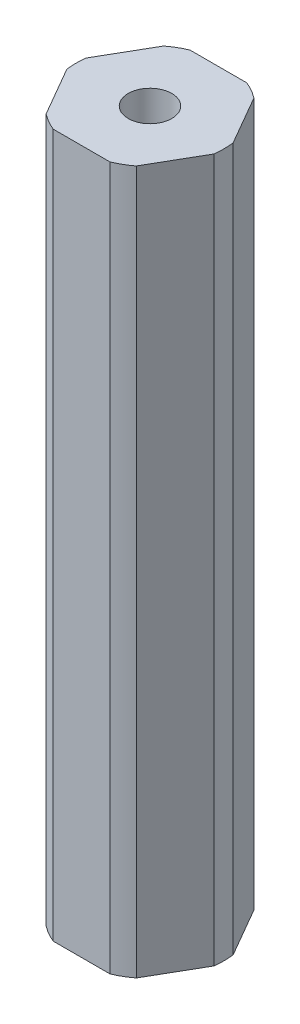
ISO-10303-21;
HEADER;
FILE_DESCRIPTION(('STEP AP214'),'2;1');
FILE_NAME('part.step','',(''),(''),'','','');
FILE_SCHEMA(('AUTOMOTIVE_DESIGN { 1 0 10303 214 1 1 1 1 }'));
ENDSEC;
DATA;
#1=APPLICATION_CONTEXT('core data for automotive mechanical design processes');
#2=APPLICATION_PROTOCOL_DEFINITION('international standard','automotive_design',2000,#1);
#3=PRODUCT_CONTEXT('',#1,'mechanical');
#4=PRODUCT('Part','Part','',(#3));
#5=PRODUCT_RELATED_PRODUCT_CATEGORY('part','',(#4));
#6=PRODUCT_DEFINITION_FORMATION('','',#4);
#7=PRODUCT_DEFINITION_CONTEXT('part definition',#1,'design');
#8=PRODUCT_DEFINITION('design','',#6,#7);
#9=PRODUCT_DEFINITION_SHAPE('','',#8);
#10=(LENGTH_UNIT() NAMED_UNIT(*) SI_UNIT(.MILLI.,.METRE.));
#11=(NAMED_UNIT(*) PLANE_ANGLE_UNIT() SI_UNIT($,.RADIAN.));
#12=(NAMED_UNIT(*) SI_UNIT($,.STERADIAN.) SOLID_ANGLE_UNIT());
#13=UNCERTAINTY_MEASURE_WITH_UNIT(LENGTH_MEASURE(1.E-05),#10,'distance_accuracy_value','');
#14=(GEOMETRIC_REPRESENTATION_CONTEXT(3) GLOBAL_UNCERTAINTY_ASSIGNED_CONTEXT((#13)) GLOBAL_UNIT_ASSIGNED_CONTEXT((#10,
#11,#12)) REPRESENTATION_CONTEXT('',''));
#15=CARTESIAN_POINT('',(0.,0.,0.));
#16=DIRECTION('',(0.,0.,1.));
#17=DIRECTION('',(1.,0.,0.));
#18=AXIS2_PLACEMENT_3D('',#15,#16,#17);
#19=CARTESIAN_POINT('',(5.49926131403119,65.2394428,3.175));
#20=DIRECTION('',(0.866025403784439,0.,0.5));
#21=DIRECTION('',(0.5,0.,-0.866025403784439));
#22=AXIS2_PLACEMENT_3D('',#19,#20,#21);
#23=PLANE('',#22);
#24=DIRECTION('',(-0.5,0.,0.866025403784439));
#25=VECTOR('',#24,1.);
#26=CARTESIAN_POINT('',(5.49926131403119,65.2394428,3.175));
#27=LINE('',#26,#25);
#28=CARTESIAN_POINT('',(6.81675182633099,65.2394428,0.893039494206794));
#29=VERTEX_POINT('',#28);
#30=CARTESIAN_POINT('',(4.18177080173138,65.2394428,5.45696050579321));
#31=VERTEX_POINT('',#30);
#32=EDGE_CURVE('E141',#29,#31,#27,.T.);
#33=ORIENTED_EDGE('',*,*,#32,.T.);
#34=DIRECTION('',(0.,-1.,0.));
#35=VECTOR('',#34,1.);
#36=CARTESIAN_POINT('',(4.18177080173138,68.4664939470401,5.45696050579321));
#37=LINE('',#36,#35);
#38=CARTESIAN_POINT('',(4.18177080173138,0.,5.45696050579321));
#39=VERTEX_POINT('',#38);
#40=EDGE_CURVE('E189',#31,#39,#37,.T.);
#41=ORIENTED_EDGE('',*,*,#40,.T.);
#42=DIRECTION('',(-0.5,0.,0.866025403784439));
#43=VECTOR('',#42,1.);
#44=CARTESIAN_POINT('',(5.49926131403119,0.,3.175));
#45=LINE('',#44,#43);
#46=CARTESIAN_POINT('',(6.81675182633099,0.,0.893039494206794));
#47=VERTEX_POINT('',#46);
#48=EDGE_CURVE('E131',#47,#39,#45,.T.);
#49=ORIENTED_EDGE('',*,*,#48,.F.);
#50=DIRECTION('',(0.,-1.,0.));
#51=VECTOR('',#50,1.);
#52=CARTESIAN_POINT('',(6.81675182633099,68.4664939470401,0.893039494206794));
#53=LINE('',#52,#51);
#54=EDGE_CURVE('E180',#47,#29,#53,.F.);
#55=ORIENTED_EDGE('',*,*,#54,.T.);
#56=EDGE_LOOP('',(#33,#41,#49,#55));
#57=FACE_BOUND('',#56,.T.);
#58=ADVANCED_FACE('F17',(#57),#23,.T.);
#59=CARTESIAN_POINT('',(0.,65.2394428,6.35));
#60=DIRECTION('',(0.,0.,1.));
#61=DIRECTION('',(1.,0.,0.));
#62=AXIS2_PLACEMENT_3D('',#59,#60,#61);
#63=PLANE('',#62);
#64=DIRECTION('',(-1.,0.,0.));
#65=VECTOR('',#64,1.);
#66=CARTESIAN_POINT('',(0.,65.2394428,6.35));
#67=LINE('',#66,#65);
#68=CARTESIAN_POINT('',(2.63498102459961,65.2394428,6.35));
#69=VERTEX_POINT('',#68);
#70=CARTESIAN_POINT('',(-2.63498102459961,65.2394428,6.35));
#71=VERTEX_POINT('',#70);
#72=EDGE_CURVE('E170',#69,#71,#67,.T.);
#73=ORIENTED_EDGE('',*,*,#72,.T.);
#74=DIRECTION('',(0.,-1.,0.));
#75=VECTOR('',#74,1.);
#76=CARTESIAN_POINT('',(-2.63498102459961,68.4664939470401,6.35));
#77=LINE('',#76,#75);
#78=CARTESIAN_POINT('',(-2.63498102459961,0.,6.35));
#79=VERTEX_POINT('',#78);
#80=EDGE_CURVE('E35',#71,#79,#77,.T.);
#81=ORIENTED_EDGE('',*,*,#80,.T.);
#82=DIRECTION('',(-1.,0.,0.));
#83=VECTOR('',#82,1.);
#84=CARTESIAN_POINT('',(0.,0.,6.35));
#85=LINE('',#84,#83);
#86=CARTESIAN_POINT('',(2.63498102459961,0.,6.35));
#87=VERTEX_POINT('',#86);
#88=EDGE_CURVE('E149',#87,#79,#85,.T.);
#89=ORIENTED_EDGE('',*,*,#88,.F.);
#90=DIRECTION('',(0.,-1.,0.));
#91=VECTOR('',#90,1.);
#92=CARTESIAN_POINT('',(2.63498102459961,68.4664939470401,6.35));
#93=LINE('',#92,#91);
#94=EDGE_CURVE('E193',#87,#69,#93,.F.);
#95=ORIENTED_EDGE('',*,*,#94,.T.);
#96=EDGE_LOOP('',(#73,#81,#89,#95));
#97=FACE_BOUND('',#96,.T.);
#98=ADVANCED_FACE('F250',(#97),#63,.T.);
#99=CARTESIAN_POINT('',(-5.49926131403119,65.2394428,3.175));
#100=DIRECTION('',(-0.866025403784439,0.,0.5));
#101=DIRECTION('',(0.5,0.,0.866025403784439));
#102=AXIS2_PLACEMENT_3D('',#99,#100,#101);
#103=PLANE('',#102);
#104=DIRECTION('',(-0.5,0.,-0.866025403784439));
#105=VECTOR('',#104,1.);
#106=CARTESIAN_POINT('',(-5.49926131403119,65.2394428,3.175));
#107=LINE('',#106,#105);
#108=CARTESIAN_POINT('',(-4.18177080173138,65.2394428,5.45696050579321));
#109=VERTEX_POINT('',#108);
#110=CARTESIAN_POINT('',(-6.81675182633099,65.2394428,0.893039494206794));
#111=VERTEX_POINT('',#110);
#112=EDGE_CURVE('E166',#109,#111,#107,.T.);
#113=ORIENTED_EDGE('',*,*,#112,.T.);
#114=DIRECTION('',(0.,-1.,0.));
#115=VECTOR('',#114,1.);
#116=CARTESIAN_POINT('',(-6.81675182633099,68.4664939470401,0.893039494206794));
#117=LINE('',#116,#115);
#118=CARTESIAN_POINT('',(-6.81675182633099,0.,0.893039494206794));
#119=VERTEX_POINT('',#118);
#120=EDGE_CURVE('E43',#111,#119,#117,.T.);
#121=ORIENTED_EDGE('',*,*,#120,.T.);
#122=DIRECTION('',(-0.5,0.,-0.866025403784439));
#123=VECTOR('',#122,1.);
#124=CARTESIAN_POINT('',(-5.49926131403119,0.,3.175));
#125=LINE('',#124,#123);
#126=CARTESIAN_POINT('',(-4.18177080173138,0.,5.45696050579321));
#127=VERTEX_POINT('',#126);
#128=EDGE_CURVE('E143',#127,#119,#125,.T.);
#129=ORIENTED_EDGE('',*,*,#128,.F.);
#130=DIRECTION('',(0.,-1.,0.));
#131=VECTOR('',#130,1.);
#132=CARTESIAN_POINT('',(-4.18177080173138,68.4664939470401,5.45696050579321));
#133=LINE('',#132,#131);
#134=EDGE_CURVE('E200',#127,#109,#133,.F.);
#135=ORIENTED_EDGE('',*,*,#134,.T.);
#136=EDGE_LOOP('',(#113,#121,#129,#135));
#137=FACE_BOUND('',#136,.T.);
#138=ADVANCED_FACE('F255',(#137),#103,.T.);
#139=CARTESIAN_POINT('',(-5.49926131403119,65.2394428,-3.175));
#140=DIRECTION('',(-0.866025403784439,0.,-0.5));
#141=DIRECTION('',(-0.5,0.,0.866025403784439));
#142=AXIS2_PLACEMENT_3D('',#139,#140,#141);
#143=PLANE('',#142);
#144=DIRECTION('',(0.5,0.,-0.866025403784439));
#145=VECTOR('',#144,1.);
#146=CARTESIAN_POINT('',(-5.49926131403119,65.2394428,-3.175));
#147=LINE('',#146,#145);
#148=CARTESIAN_POINT('',(-6.81675182633099,65.2394428,-0.893039494206793));
#149=VERTEX_POINT('',#148);
#150=CARTESIAN_POINT('',(-4.18177080173138,65.2394428,-5.45696050579321));
#151=VERTEX_POINT('',#150);
#152=EDGE_CURVE('E162',#149,#151,#147,.T.);
#153=ORIENTED_EDGE('',*,*,#152,.T.);
#154=DIRECTION('',(0.,-1.,0.));
#155=VECTOR('',#154,1.);
#156=CARTESIAN_POINT('',(-4.18177080173138,68.4664939470401,-5.45696050579321));
#157=LINE('',#156,#155);
#158=CARTESIAN_POINT('',(-4.18177080173138,0.,-5.45696050579321));
#159=VERTEX_POINT('',#158);
#160=EDGE_CURVE('E212',#151,#159,#157,.T.);
#161=ORIENTED_EDGE('',*,*,#160,.T.);
#162=DIRECTION('',(0.5,0.,-0.866025403784439));
#163=VECTOR('',#162,1.);
#164=CARTESIAN_POINT('',(-5.49926131403119,0.,-3.175));
#165=LINE('',#164,#163);
#166=CARTESIAN_POINT('',(-6.81675182633099,0.,-0.893039494206793));
#167=VERTEX_POINT('',#166);
#168=EDGE_CURVE('E137',#167,#159,#165,.T.);
#169=ORIENTED_EDGE('',*,*,#168,.F.);
#170=DIRECTION('',(0.,-1.,0.));
#171=VECTOR('',#170,1.);
#172=CARTESIAN_POINT('',(-6.81675182633099,68.4664939470401,-0.893039494206793));
#173=LINE('',#172,#171);
#174=EDGE_CURVE('E207',#167,#149,#173,.F.);
#175=ORIENTED_EDGE('',*,*,#174,.T.);
#176=EDGE_LOOP('',(#153,#161,#169,#175));
#177=FACE_BOUND('',#176,.T.);
#178=ADVANCED_FACE('F309',(#177),#143,.T.);
#179=CARTESIAN_POINT('',(0.,65.2394428,-6.35));
#180=DIRECTION('',(0.,0.,-1.));
#181=DIRECTION('',(-1.,0.,0.));
#182=AXIS2_PLACEMENT_3D('',#179,#180,#181);
#183=PLANE('',#182);
#184=DIRECTION('',(1.,0.,0.));
#185=VECTOR('',#184,1.);
#186=CARTESIAN_POINT('',(0.,65.2394428,-6.35));
#187=LINE('',#186,#185);
#188=CARTESIAN_POINT('',(-2.63498102459961,65.2394428,-6.35));
#189=VERTEX_POINT('',#188);
#190=CARTESIAN_POINT('',(2.63498102459961,65.2394428,-6.35));
#191=VERTEX_POINT('',#190);
#192=EDGE_CURVE('E129',#189,#191,#187,.T.);
#193=ORIENTED_EDGE('',*,*,#192,.T.);
#194=DIRECTION('',(0.,-1.,0.));
#195=VECTOR('',#194,1.);
#196=CARTESIAN_POINT('',(2.63498102459961,68.4664939470401,-6.35));
#197=LINE('',#196,#195);
#198=CARTESIAN_POINT('',(2.63498102459961,0.,-6.35));
#199=VERTEX_POINT('',#198);
#200=EDGE_CURVE('E110',#191,#199,#197,.T.);
#201=ORIENTED_EDGE('',*,*,#200,.T.);
#202=DIRECTION('',(1.,0.,0.));
#203=VECTOR('',#202,1.);
#204=CARTESIAN_POINT('',(0.,0.,-6.35));
#205=LINE('',#204,#203);
#206=CARTESIAN_POINT('',(-2.63498102459961,0.,-6.35));
#207=VERTEX_POINT('',#206);
#208=EDGE_CURVE('E127',#207,#199,#205,.T.);
#209=ORIENTED_EDGE('',*,*,#208,.F.);
#210=DIRECTION('',(0.,-1.,0.));
#211=VECTOR('',#210,1.);
#212=CARTESIAN_POINT('',(-2.63498102459961,68.4664939470401,-6.35));
#213=LINE('',#212,#211);
#214=EDGE_CURVE('E216',#207,#189,#213,.F.);
#215=ORIENTED_EDGE('',*,*,#214,.T.);
#216=EDGE_LOOP('',(#193,#201,#209,#215));
#217=FACE_BOUND('',#216,.T.);
#218=ADVANCED_FACE('F125',(#217),#183,.T.);
#219=CARTESIAN_POINT('',(5.49926131403119,65.2394428,-3.175));
#220=DIRECTION('',(0.866025403784439,0.,-0.5));
#221=DIRECTION('',(-0.5,0.,-0.866025403784439));
#222=AXIS2_PLACEMENT_3D('',#219,#220,#221);
#223=PLANE('',#222);
#224=DIRECTION('',(0.5,0.,0.866025403784439));
#225=VECTOR('',#224,1.);
#226=CARTESIAN_POINT('',(5.49926131403119,65.2394428,-3.175));
#227=LINE('',#226,#225);
#228=CARTESIAN_POINT('',(4.18177080173138,65.2394428,-5.45696050579321));
#229=VERTEX_POINT('',#228);
#230=CARTESIAN_POINT('',(6.81675182633099,65.2394428,-0.893039494206797));
#231=VERTEX_POINT('',#230);
#232=EDGE_CURVE('E156',#229,#231,#227,.T.);
#233=ORIENTED_EDGE('',*,*,#232,.T.);
#234=DIRECTION('',(0.,-1.,0.));
#235=VECTOR('',#234,1.);
#236=CARTESIAN_POINT('',(6.81675182633099,68.4664939470401,-0.8930394942068));
#237=LINE('',#236,#235);
#238=CARTESIAN_POINT('',(6.81675182633099,0.,-0.893039494206797));
#239=VERTEX_POINT('',#238);
#240=EDGE_CURVE('E184',#231,#239,#237,.T.);
#241=ORIENTED_EDGE('',*,*,#240,.T.);
#242=DIRECTION('',(0.5,0.,0.866025403784439));
#243=VECTOR('',#242,1.);
#244=CARTESIAN_POINT('',(5.49926131403119,0.,-3.175));
#245=LINE('',#244,#243);
#246=CARTESIAN_POINT('',(4.18177080173138,0.,-5.45696050579321));
#247=VERTEX_POINT('',#246);
#248=EDGE_CURVE('E20',#247,#239,#245,.T.);
#249=ORIENTED_EDGE('',*,*,#248,.F.);
#250=DIRECTION('',(0.,-1.,0.));
#251=VECTOR('',#250,1.);
#252=CARTESIAN_POINT('',(4.18177080173138,68.4664939470401,-5.45696050579321));
#253=LINE('',#252,#251);
#254=EDGE_CURVE('E113',#247,#229,#253,.F.);
#255=ORIENTED_EDGE('',*,*,#254,.T.);
#256=EDGE_LOOP('',(#233,#241,#249,#255));
#257=FACE_BOUND('',#256,.T.);
#258=ADVANCED_FACE('F245',(#257),#223,.T.);
#259=CARTESIAN_POINT('',(0.,65.2394428,0.));
#260=DIRECTION('',(0.,-1.,0.));
#261=DIRECTION('',(1.,0.,0.));
#262=AXIS2_PLACEMENT_3D('',#259,#260,#261);
#263=PLANE('',#262);
#264=CARTESIAN_POINT('',(0.,65.2394428,0.));
#265=DIRECTION('',(0.,-1.,0.));
#266=DIRECTION('',(0.,0.,-1.));
#267=AXIS2_PLACEMENT_3D('',#264,#265,#266);
#268=CIRCLE('',#267,2.0193);
#269=CARTESIAN_POINT('',(0.,65.2394428,-2.0193));
#270=VERTEX_POINT('',#269);
#271=EDGE_CURVE('E120',#270,#270,#268,.T.);
#272=ORIENTED_EDGE('',*,*,#271,.T.);
#273=EDGE_LOOP('',(#272));
#274=FACE_BOUND('',#273,.T.);
#275=CARTESIAN_POINT('',(0.,65.2394428,0.));
#276=DIRECTION('',(0.,-1.,0.));
#277=DIRECTION('',(0.,0.,-1.));
#278=AXIS2_PLACEMENT_3D('',#275,#276,#277);
#279=CIRCLE('',#278,6.875);
#280=EDGE_CURVE('E179',#191,#229,#279,.T.);
#281=ORIENTED_EDGE('',*,*,#280,.F.);
#282=ORIENTED_EDGE('',*,*,#192,.F.);
#283=EDGE_CURVE('E119',#151,#189,#279,.T.);
#284=ORIENTED_EDGE('',*,*,#283,.F.);
#285=ORIENTED_EDGE('',*,*,#152,.F.);
#286=EDGE_CURVE('E211',#111,#149,#279,.T.);
#287=ORIENTED_EDGE('',*,*,#286,.F.);
#288=ORIENTED_EDGE('',*,*,#112,.F.);
#289=EDGE_CURVE('E204',#71,#109,#279,.T.);
#290=ORIENTED_EDGE('',*,*,#289,.F.);
#291=ORIENTED_EDGE('',*,*,#72,.F.);
#292=EDGE_CURVE('E197',#31,#69,#279,.T.);
#293=ORIENTED_EDGE('',*,*,#292,.F.);
#294=ORIENTED_EDGE('',*,*,#32,.F.);
#295=EDGE_CURVE('E188',#231,#29,#279,.T.);
#296=ORIENTED_EDGE('',*,*,#295,.F.);
#297=ORIENTED_EDGE('',*,*,#232,.F.);
#298=EDGE_LOOP('',(#281,#282,#284,#285,#287,#288,#290,#291,#293,#294,#296,#297));
#299=FACE_BOUND('',#298,.T.);
#300=ADVANCED_FACE('F234',(#274,#299),#263,.F.);
#301=CARTESIAN_POINT('',(0.,0.,0.));
#302=DIRECTION('',(0.,-1.,0.));
#303=DIRECTION('',(1.,0.,0.));
#304=AXIS2_PLACEMENT_3D('',#301,#302,#303);
#305=PLANE('',#304);
#306=CARTESIAN_POINT('',(0.,0.,0.));
#307=DIRECTION('',(0.,-1.,0.));
#308=DIRECTION('',(0.,0.,-1.));
#309=AXIS2_PLACEMENT_3D('',#306,#307,#308);
#310=CIRCLE('',#309,2.0193);
#311=CARTESIAN_POINT('',(0.,0.,-2.0193));
#312=VERTEX_POINT('',#311);
#313=EDGE_CURVE('E223',#312,#312,#310,.T.);
#314=ORIENTED_EDGE('',*,*,#313,.F.);
#315=EDGE_LOOP('',(#314));
#316=FACE_BOUND('',#315,.T.);
#317=ORIENTED_EDGE('',*,*,#208,.T.);
#318=CARTESIAN_POINT('',(0.,0.,0.));
#319=DIRECTION('',(0.,-1.,0.));
#320=DIRECTION('',(0.,0.,-1.));
#321=AXIS2_PLACEMENT_3D('',#318,#319,#320);
#322=CIRCLE('',#321,6.875);
#323=EDGE_CURVE('E28',#199,#247,#322,.T.);
#324=ORIENTED_EDGE('',*,*,#323,.T.);
#325=ORIENTED_EDGE('',*,*,#248,.T.);
#326=EDGE_CURVE('E11',#239,#47,#322,.T.);
#327=ORIENTED_EDGE('',*,*,#326,.T.);
#328=ORIENTED_EDGE('',*,*,#48,.T.);
#329=EDGE_CURVE('E26',#39,#87,#322,.T.);
#330=ORIENTED_EDGE('',*,*,#329,.T.);
#331=ORIENTED_EDGE('',*,*,#88,.T.);
#332=EDGE_CURVE('E405',#79,#127,#322,.T.);
#333=ORIENTED_EDGE('',*,*,#332,.T.);
#334=ORIENTED_EDGE('',*,*,#128,.T.);
#335=EDGE_CURVE('E403',#119,#167,#322,.T.);
#336=ORIENTED_EDGE('',*,*,#335,.T.);
#337=ORIENTED_EDGE('',*,*,#168,.T.);
#338=EDGE_CURVE('E121',#159,#207,#322,.T.);
#339=ORIENTED_EDGE('',*,*,#338,.T.);
#340=EDGE_LOOP('',(#317,#324,#325,#327,#328,#330,#331,#333,#334,#336,#337,#339));
#341=FACE_BOUND('',#340,.T.);
#342=ADVANCED_FACE('F134',(#316,#341),#305,.T.);
#343=CARTESIAN_POINT('',(0.,68.4664939470401,0.));
#344=DIRECTION('',(0.,-1.,0.));
#345=DIRECTION('',(0.,0.,-1.));
#346=AXIS2_PLACEMENT_3D('',#343,#344,#345);
#347=CYLINDRICAL_SURFACE('',#346,6.875);
#348=ORIENTED_EDGE('',*,*,#283,.T.);
#349=ORIENTED_EDGE('',*,*,#214,.F.);
#350=ORIENTED_EDGE('',*,*,#338,.F.);
#351=ORIENTED_EDGE('',*,*,#160,.F.);
#352=EDGE_LOOP('',(#348,#349,#350,#351));
#353=FACE_BOUND('',#352,.T.);
#354=ADVANCED_FACE('F233',(#353),#347,.T.);
#355=ORIENTED_EDGE('',*,*,#286,.T.);
#356=ORIENTED_EDGE('',*,*,#174,.F.);
#357=ORIENTED_EDGE('',*,*,#335,.F.);
#358=ORIENTED_EDGE('',*,*,#120,.F.);
#359=EDGE_LOOP('',(#355,#356,#357,#358));
#360=FACE_BOUND('',#359,.T.);
#361=ADVANCED_FACE('F242',(#360),#347,.T.);
#362=ORIENTED_EDGE('',*,*,#289,.T.);
#363=ORIENTED_EDGE('',*,*,#134,.F.);
#364=ORIENTED_EDGE('',*,*,#332,.F.);
#365=ORIENTED_EDGE('',*,*,#80,.F.);
#366=EDGE_LOOP('',(#362,#363,#364,#365));
#367=FACE_BOUND('',#366,.T.);
#368=ADVANCED_FACE('F278',(#367),#347,.T.);
#369=ORIENTED_EDGE('',*,*,#292,.T.);
#370=ORIENTED_EDGE('',*,*,#94,.F.);
#371=ORIENTED_EDGE('',*,*,#329,.F.);
#372=ORIENTED_EDGE('',*,*,#40,.F.);
#373=EDGE_LOOP('',(#369,#370,#371,#372));
#374=FACE_BOUND('',#373,.T.);
#375=ADVANCED_FACE('F274',(#374),#347,.T.);
#376=ORIENTED_EDGE('',*,*,#326,.F.);
#377=ORIENTED_EDGE('',*,*,#240,.F.);
#378=ORIENTED_EDGE('',*,*,#295,.T.);
#379=ORIENTED_EDGE('',*,*,#54,.F.);
#380=EDGE_LOOP('',(#376,#377,#378,#379));
#381=FACE_BOUND('',#380,.T.);
#382=ADVANCED_FACE('F272',(#381),#347,.T.);
#383=ORIENTED_EDGE('',*,*,#280,.T.);
#384=ORIENTED_EDGE('',*,*,#254,.F.);
#385=ORIENTED_EDGE('',*,*,#323,.F.);
#386=ORIENTED_EDGE('',*,*,#200,.F.);
#387=EDGE_LOOP('',(#383,#384,#385,#386));
#388=FACE_BOUND('',#387,.T.);
#389=ADVANCED_FACE('F109',(#388),#347,.T.);
#390=CARTESIAN_POINT('',(0.,67.881477049306,0.));
#391=DIRECTION('',(0.,-1.,0.));
#392=DIRECTION('',(0.,0.,-1.));
#393=AXIS2_PLACEMENT_3D('',#390,#391,#392);
#394=CYLINDRICAL_SURFACE('',#393,2.0193);
#395=ORIENTED_EDGE('',*,*,#313,.T.);
#396=EDGE_LOOP('',(#395));
#397=FACE_BOUND('',#396,.T.);
#398=ORIENTED_EDGE('',*,*,#271,.F.);
#399=EDGE_LOOP('',(#398));
#400=FACE_BOUND('',#399,.T.);
#401=ADVANCED_FACE('F229',(#397,#400),#394,.F.);
#402=CLOSED_SHELL('',(#58,#98,#138,#178,#218,#258,#300,#342,#354,#361,#368,#375,#382,#389,#401));
#403=MANIFOLD_SOLID_BREP('B1',#402);
#404=ADVANCED_BREP_SHAPE_REPRESENTATION('',(#18,#403),#14);
#405=SHAPE_DEFINITION_REPRESENTATION(#9,#404);
ENDSEC;
END-ISO-10303-21;
